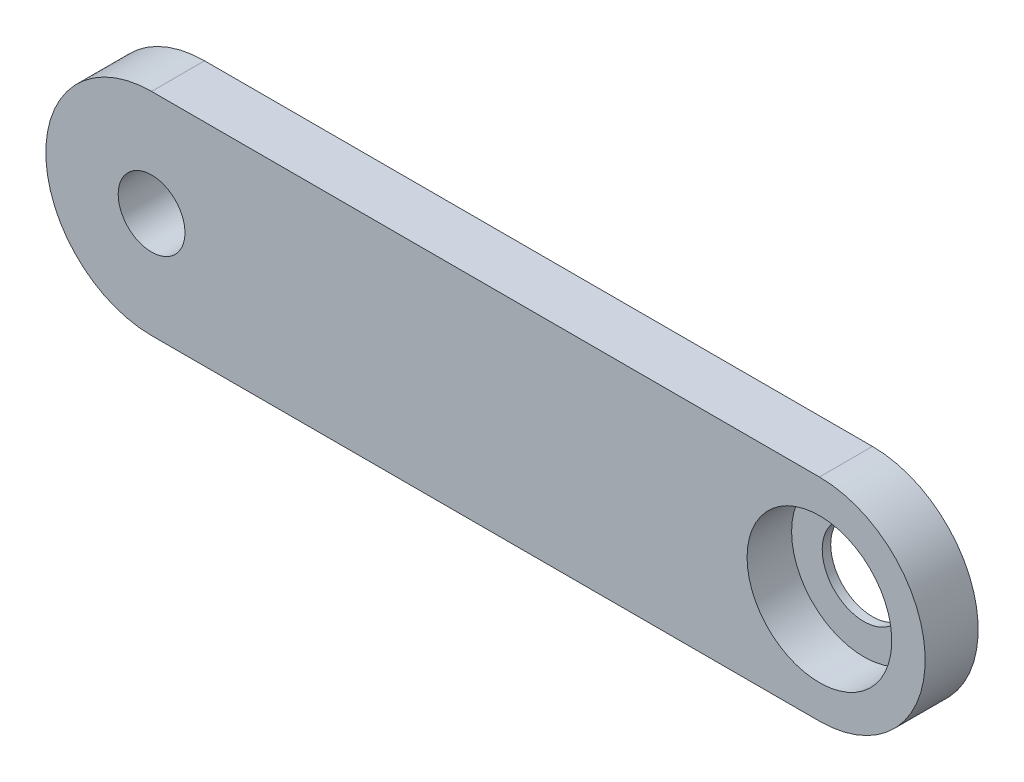
ISO-10303-21;
HEADER;
FILE_DESCRIPTION(('STEP AP214'),'2;1');
FILE_NAME('part.step','',(''),(''),'','','');
FILE_SCHEMA(('AUTOMOTIVE_DESIGN { 1 0 10303 214 1 1 1 1 }'));
ENDSEC;
DATA;
#1=APPLICATION_CONTEXT('core data for automotive mechanical design processes');
#2=APPLICATION_PROTOCOL_DEFINITION('international standard','automotive_design',2000,#1);
#3=PRODUCT_CONTEXT('',#1,'mechanical');
#4=PRODUCT('Part','Part','',(#3));
#5=PRODUCT_RELATED_PRODUCT_CATEGORY('part','',(#4));
#6=PRODUCT_DEFINITION_FORMATION('','',#4);
#7=PRODUCT_DEFINITION_CONTEXT('part definition',#1,'design');
#8=PRODUCT_DEFINITION('design','',#6,#7);
#9=PRODUCT_DEFINITION_SHAPE('','',#8);
#10=(LENGTH_UNIT() NAMED_UNIT(*) SI_UNIT(.MILLI.,.METRE.));
#11=(NAMED_UNIT(*) PLANE_ANGLE_UNIT() SI_UNIT($,.RADIAN.));
#12=(NAMED_UNIT(*) SI_UNIT($,.STERADIAN.) SOLID_ANGLE_UNIT());
#13=UNCERTAINTY_MEASURE_WITH_UNIT(LENGTH_MEASURE(1.E-05),#10,'distance_accuracy_value','');
#14=(GEOMETRIC_REPRESENTATION_CONTEXT(3) GLOBAL_UNCERTAINTY_ASSIGNED_CONTEXT((#13)) GLOBAL_UNIT_ASSIGNED_CONTEXT((#10,
#11,#12)) REPRESENTATION_CONTEXT('',''));
#15=CARTESIAN_POINT('',(0.,0.,0.));
#16=DIRECTION('',(0.,0.,1.));
#17=DIRECTION('',(1.,0.,0.));
#18=AXIS2_PLACEMENT_3D('',#15,#16,#17);
#19=CARTESIAN_POINT('',(120.,0.,9.525));
#20=DIRECTION('',(0.,0.,-1.));
#21=DIRECTION('',(-1.,0.,0.));
#22=AXIS2_PLACEMENT_3D('',#19,#20,#21);
#23=CYLINDRICAL_SURFACE('',#22,13.);
#24=CARTESIAN_POINT('',(120.,0.,9.525));
#25=DIRECTION('',(0.,0.,1.));
#26=DIRECTION('',(1.,0.,0.));
#27=AXIS2_PLACEMENT_3D('',#24,#25,#26);
#28=CIRCLE('',#27,13.);
#29=CARTESIAN_POINT('',(107.,0.,9.525));
#30=VERTEX_POINT('',#29);
#31=EDGE_CURVE('E117',#30,#30,#28,.T.);
#32=CARTESIAN_POINT('',(120.,0.,1.525));
#33=DIRECTION('',(0.,0.,-1.));
#34=DIRECTION('',(-1.,0.,0.));
#35=AXIS2_PLACEMENT_3D('',#32,#33,#34);
#36=CIRCLE('',#35,13.);
#37=CARTESIAN_POINT('',(107.,0.,1.525));
#38=VERTEX_POINT('',#37);
#39=EDGE_CURVE('E122',#38,#38,#36,.T.);
#40=CARTESIAN_POINT('',(107.,0.,9.525));
#41=CARTESIAN_POINT('',(107.,0.,9.44166666666667));
#42=CARTESIAN_POINT('',(107.,0.,9.35833333333333));
#43=CARTESIAN_POINT('',(107.,0.,9.19166666666667));
#44=CARTESIAN_POINT('',(107.,0.,9.10833333333333));
#45=CARTESIAN_POINT('',(107.,0.,8.94166666666667));
#46=CARTESIAN_POINT('',(107.,0.,8.85833333333333));
#47=CARTESIAN_POINT('',(107.,0.,8.69166666666667));
#48=CARTESIAN_POINT('',(107.,0.,8.60833333333333));
#49=CARTESIAN_POINT('',(107.,0.,8.44166666666667));
#50=CARTESIAN_POINT('',(107.,0.,8.35833333333333));
#51=CARTESIAN_POINT('',(107.,0.,8.19166666666667));
#52=CARTESIAN_POINT('',(107.,0.,8.10833333333333));
#53=CARTESIAN_POINT('',(107.,0.,7.94166666666667));
#54=CARTESIAN_POINT('',(107.,0.,7.85833333333333));
#55=CARTESIAN_POINT('',(107.,0.,7.69166666666667));
#56=CARTESIAN_POINT('',(107.,0.,7.60833333333333));
#57=CARTESIAN_POINT('',(107.,0.,7.44166666666667));
#58=CARTESIAN_POINT('',(107.,0.,7.35833333333333));
#59=CARTESIAN_POINT('',(107.,0.,7.19166666666667));
#60=CARTESIAN_POINT('',(107.,0.,7.10833333333333));
#61=CARTESIAN_POINT('',(107.,0.,6.94166666666667));
#62=CARTESIAN_POINT('',(107.,0.,6.85833333333333));
#63=CARTESIAN_POINT('',(107.,0.,6.69166666666667));
#64=CARTESIAN_POINT('',(107.,0.,6.60833333333333));
#65=CARTESIAN_POINT('',(107.,0.,6.44166666666667));
#66=CARTESIAN_POINT('',(107.,0.,6.35833333333334));
#67=CARTESIAN_POINT('',(107.,0.,6.19166666666667));
#68=CARTESIAN_POINT('',(107.,0.,6.10833333333333));
#69=CARTESIAN_POINT('',(107.,0.,5.94166666666667));
#70=CARTESIAN_POINT('',(107.,0.,5.85833333333333));
#71=CARTESIAN_POINT('',(107.,0.,5.69166666666667));
#72=CARTESIAN_POINT('',(107.,0.,5.60833333333333));
#73=CARTESIAN_POINT('',(107.,0.,5.44166666666667));
#74=CARTESIAN_POINT('',(107.,0.,5.35833333333334));
#75=CARTESIAN_POINT('',(107.,0.,5.19166666666667));
#76=CARTESIAN_POINT('',(107.,0.,5.10833333333333));
#77=CARTESIAN_POINT('',(107.,0.,4.94166666666667));
#78=CARTESIAN_POINT('',(107.,0.,4.85833333333334));
#79=CARTESIAN_POINT('',(107.,0.,4.69166666666667));
#80=CARTESIAN_POINT('',(107.,0.,4.60833333333334));
#81=CARTESIAN_POINT('',(107.,0.,4.44166666666667));
#82=CARTESIAN_POINT('',(107.,0.,4.35833333333333));
#83=CARTESIAN_POINT('',(107.,0.,4.19166666666667));
#84=CARTESIAN_POINT('',(107.,0.,4.10833333333334));
#85=CARTESIAN_POINT('',(107.,0.,3.94166666666667));
#86=CARTESIAN_POINT('',(107.,0.,3.85833333333333));
#87=CARTESIAN_POINT('',(107.,0.,3.69166666666667));
#88=CARTESIAN_POINT('',(107.,0.,3.60833333333334));
#89=CARTESIAN_POINT('',(107.,0.,3.44166666666667));
#90=CARTESIAN_POINT('',(107.,0.,3.35833333333334));
#91=CARTESIAN_POINT('',(107.,0.,3.19166666666667));
#92=CARTESIAN_POINT('',(107.,0.,3.10833333333333));
#93=CARTESIAN_POINT('',(107.,0.,2.94166666666667));
#94=CARTESIAN_POINT('',(107.,0.,2.85833333333333));
#95=CARTESIAN_POINT('',(107.,0.,2.69166666666667));
#96=CARTESIAN_POINT('',(107.,0.,2.60833333333334));
#97=CARTESIAN_POINT('',(107.,0.,2.44166666666667));
#98=CARTESIAN_POINT('',(107.,0.,2.35833333333334));
#99=CARTESIAN_POINT('',(107.,0.,2.19166666666667));
#100=CARTESIAN_POINT('',(107.,0.,2.10833333333333));
#101=CARTESIAN_POINT('',(107.,0.,1.94166666666667));
#102=CARTESIAN_POINT('',(107.,0.,1.85833333333334));
#103=CARTESIAN_POINT('',(107.,0.,1.69166666666667));
#104=CARTESIAN_POINT('',(107.,0.,1.60833333333334));
#105=CARTESIAN_POINT('',(107.,0.,1.525));
#106=B_SPLINE_CURVE_WITH_KNOTS('',3,(#40,#41,#42,#43,#44,#45,#46,#47,#48,#49,#50,#51,#52,#53,
#54,#55,#56,#57,#58,#59,#60,#61,#62,#63,#64,#65,#66,#67,#68,#69,#70,#71,#72,#73,#74,#75,#76,#77,
#78,#79,#80,#81,#82,#83,#84,#85,#86,#87,#88,#89,#90,#91,#92,#93,#94,#95,#96,#97,#98,#99,#100,
#101,#102,#103,#104,#105),.UNSPECIFIED.,.F.,.F.,(4,2,2,2,2,2,2,2,2,2,2,2,2,2,2,2,2,2,2,2,2,2,2,
2,2,2,2,2,2,2,2,2,4),(0.,0.249999999999999,0.499999999999999,0.749999999999999,
0.999999999999999,1.25,1.5,1.75,2.,2.25,2.5,2.75,3.,3.25,3.5,3.75,4.,4.25,4.5,4.75,5.,5.25,5.5,
5.75,6.,6.25,6.5,6.75,7.,7.25,7.5,7.75,8.),.UNSPECIFIED.);
#107=EDGE_CURVE('BSEAM34',#30,#38,#106,.T.);
#108=ORIENTED_EDGE('',*,*,#31,.T.);
#109=ORIENTED_EDGE('',*,*,#39,.T.);
#110=ORIENTED_EDGE('',*,*,#107,.T.);
#111=ORIENTED_EDGE('',*,*,#107,.F.);
#112=EDGE_LOOP('',(#108,#110,#109,#111));
#113=FACE_BOUND('',#112,.T.);
#114=ADVANCED_FACE('F34',(#113),#23,.F.);
#115=CARTESIAN_POINT('',(0.,0.,9.525));
#116=DIRECTION('',(0.,0.,1.));
#117=DIRECTION('',(1.,0.,0.));
#118=AXIS2_PLACEMENT_3D('',#115,#116,#117);
#119=PLANE('',#118);
#120=CARTESIAN_POINT('',(0.,0.,9.525));
#121=DIRECTION('',(0.,0.,1.));
#122=DIRECTION('',(1.,0.,0.));
#123=AXIS2_PLACEMENT_3D('',#120,#121,#122);
#124=CIRCLE('',#123,6.);
#125=CARTESIAN_POINT('',(-6.,0.,9.525));
#126=VERTEX_POINT('',#125);
#127=EDGE_CURVE('E102',#126,#126,#124,.T.);
#128=ORIENTED_EDGE('',*,*,#127,.F.);
#129=EDGE_LOOP('',(#128));
#130=FACE_BOUND('',#129,.T.);
#131=CARTESIAN_POINT('',(0.,0.,9.525));
#132=DIRECTION('',(0.,0.,1.));
#133=DIRECTION('',(1.,0.,0.));
#134=AXIS2_PLACEMENT_3D('',#131,#132,#133);
#135=CIRCLE('',#134,19.);
#136=CARTESIAN_POINT('',(0.,19.,9.525));
#137=VERTEX_POINT('',#136);
#138=CARTESIAN_POINT('',(0.,-19.,9.525));
#139=VERTEX_POINT('',#138);
#140=EDGE_CURVE('E87',#137,#139,#135,.T.);
#141=ORIENTED_EDGE('',*,*,#140,.T.);
#142=DIRECTION('',(1.,0.,0.));
#143=VECTOR('',#142,1.);
#144=CARTESIAN_POINT('',(0.,-19.,9.525));
#145=LINE('',#144,#143);
#146=CARTESIAN_POINT('',(120.,-19.,9.525));
#147=VERTEX_POINT('',#146);
#148=EDGE_CURVE('E81',#139,#147,#145,.T.);
#149=ORIENTED_EDGE('',*,*,#148,.T.);
#150=CARTESIAN_POINT('',(120.,0.,9.525));
#151=DIRECTION('',(0.,0.,1.));
#152=DIRECTION('',(1.,0.,0.));
#153=AXIS2_PLACEMENT_3D('',#150,#151,#152);
#154=CIRCLE('',#153,19.);
#155=CARTESIAN_POINT('',(120.,19.,9.525));
#156=VERTEX_POINT('',#155);
#157=EDGE_CURVE('E85',#147,#156,#154,.T.);
#158=ORIENTED_EDGE('',*,*,#157,.T.);
#159=DIRECTION('',(-1.,0.,0.));
#160=VECTOR('',#159,1.);
#161=CARTESIAN_POINT('',(0.,19.,9.525));
#162=LINE('',#161,#160);
#163=EDGE_CURVE('E51',#156,#137,#162,.T.);
#164=ORIENTED_EDGE('',*,*,#163,.T.);
#165=EDGE_LOOP('',(#141,#149,#158,#164));
#166=FACE_BOUND('',#165,.T.);
#167=ORIENTED_EDGE('',*,*,#31,.F.);
#168=EDGE_LOOP('',(#167));
#169=FACE_BOUND('',#168,.T.);
#170=ADVANCED_FACE('F82',(#130,#166,#169),#119,.T.);
#171=CARTESIAN_POINT('',(0.,0.,0.));
#172=DIRECTION('',(0.,0.,1.));
#173=DIRECTION('',(1.,0.,0.));
#174=AXIS2_PLACEMENT_3D('',#171,#172,#173);
#175=PLANE('',#174);
#176=CARTESIAN_POINT('',(0.,0.,0.));
#177=DIRECTION('',(0.,0.,1.));
#178=DIRECTION('',(1.,0.,0.));
#179=AXIS2_PLACEMENT_3D('',#176,#177,#178);
#180=CIRCLE('',#179,19.);
#181=CARTESIAN_POINT('',(0.,19.,0.));
#182=VERTEX_POINT('',#181);
#183=CARTESIAN_POINT('',(0.,-19.,0.));
#184=VERTEX_POINT('',#183);
#185=EDGE_CURVE('E99',#182,#184,#180,.T.);
#186=ORIENTED_EDGE('',*,*,#185,.F.);
#187=DIRECTION('',(-1.,0.,0.));
#188=VECTOR('',#187,1.);
#189=CARTESIAN_POINT('',(0.,19.,0.));
#190=LINE('',#189,#188);
#191=CARTESIAN_POINT('',(120.,19.,0.));
#192=VERTEX_POINT('',#191);
#193=EDGE_CURVE('E74',#192,#182,#190,.T.);
#194=ORIENTED_EDGE('',*,*,#193,.F.);
#195=CARTESIAN_POINT('',(120.,0.,0.));
#196=DIRECTION('',(0.,0.,1.));
#197=DIRECTION('',(1.,0.,0.));
#198=AXIS2_PLACEMENT_3D('',#195,#196,#197);
#199=CIRCLE('',#198,19.);
#200=CARTESIAN_POINT('',(120.,-19.,0.));
#201=VERTEX_POINT('',#200);
#202=EDGE_CURVE('E68',#201,#192,#199,.T.);
#203=ORIENTED_EDGE('',*,*,#202,.F.);
#204=DIRECTION('',(1.,0.,0.));
#205=VECTOR('',#204,1.);
#206=CARTESIAN_POINT('',(0.,-19.,0.));
#207=LINE('',#206,#205);
#208=EDGE_CURVE('E91',#184,#201,#207,.T.);
#209=ORIENTED_EDGE('',*,*,#208,.F.);
#210=EDGE_LOOP('',(#186,#194,#203,#209));
#211=FACE_BOUND('',#210,.T.);
#212=CARTESIAN_POINT('',(0.,0.,0.));
#213=DIRECTION('',(0.,0.,1.));
#214=DIRECTION('',(1.,0.,0.));
#215=AXIS2_PLACEMENT_3D('',#212,#213,#214);
#216=CIRCLE('',#215,6.);
#217=CARTESIAN_POINT('',(-6.,0.,0.));
#218=VERTEX_POINT('',#217);
#219=EDGE_CURVE('E114',#218,#218,#216,.T.);
#220=ORIENTED_EDGE('',*,*,#219,.T.);
#221=EDGE_LOOP('',(#220));
#222=FACE_BOUND('',#221,.T.);
#223=CARTESIAN_POINT('',(120.,0.,0.));
#224=DIRECTION('',(0.,0.,-1.));
#225=DIRECTION('',(-1.,0.,0.));
#226=AXIS2_PLACEMENT_3D('',#223,#224,#225);
#227=CIRCLE('',#226,7.50000000000001);
#228=CARTESIAN_POINT('',(112.5,0.,0.));
#229=VERTEX_POINT('',#228);
#230=EDGE_CURVE('E126',#229,#229,#227,.T.);
#231=ORIENTED_EDGE('',*,*,#230,.F.);
#232=EDGE_LOOP('',(#231));
#233=FACE_BOUND('',#232,.T.);
#234=ADVANCED_FACE('F110',(#211,#222,#233),#175,.F.);
#235=CARTESIAN_POINT('',(0.,0.,9.525));
#236=DIRECTION('',(0.,0.,-1.));
#237=DIRECTION('',(-1.,0.,0.));
#238=AXIS2_PLACEMENT_3D('',#235,#236,#237);
#239=CYLINDRICAL_SURFACE('',#238,19.);
#240=ORIENTED_EDGE('',*,*,#185,.T.);
#241=DIRECTION('',(0.,0.,-1.));
#242=VECTOR('',#241,1.);
#243=CARTESIAN_POINT('',(0.,-19.,9.525));
#244=LINE('',#243,#242);
#245=EDGE_CURVE('E11',#139,#184,#244,.T.);
#246=ORIENTED_EDGE('',*,*,#245,.F.);
#247=ORIENTED_EDGE('',*,*,#140,.F.);
#248=DIRECTION('',(0.,0.,-1.));
#249=VECTOR('',#248,1.);
#250=CARTESIAN_POINT('',(0.,19.,9.525));
#251=LINE('',#250,#249);
#252=EDGE_CURVE('E95',#137,#182,#251,.T.);
#253=ORIENTED_EDGE('',*,*,#252,.T.);
#254=EDGE_LOOP('',(#240,#246,#247,#253));
#255=FACE_BOUND('',#254,.T.);
#256=ADVANCED_FACE('F36',(#255),#239,.T.);
#257=CARTESIAN_POINT('',(0.,-19.,9.525));
#258=DIRECTION('',(0.,1.,0.));
#259=DIRECTION('',(0.,0.,1.));
#260=AXIS2_PLACEMENT_3D('',#257,#258,#259);
#261=PLANE('',#260);
#262=ORIENTED_EDGE('',*,*,#208,.T.);
#263=DIRECTION('',(0.,0.,-1.));
#264=VECTOR('',#263,1.);
#265=CARTESIAN_POINT('',(120.,-19.,9.525));
#266=LINE('',#265,#264);
#267=EDGE_CURVE('E43',#147,#201,#266,.T.);
#268=ORIENTED_EDGE('',*,*,#267,.F.);
#269=ORIENTED_EDGE('',*,*,#148,.F.);
#270=ORIENTED_EDGE('',*,*,#245,.T.);
#271=EDGE_LOOP('',(#262,#268,#269,#270));
#272=FACE_BOUND('',#271,.T.);
#273=ADVANCED_FACE('F90',(#272),#261,.F.);
#274=CARTESIAN_POINT('',(120.,0.,9.525));
#275=DIRECTION('',(0.,0.,-1.));
#276=DIRECTION('',(-1.,0.,0.));
#277=AXIS2_PLACEMENT_3D('',#274,#275,#276);
#278=CYLINDRICAL_SURFACE('',#277,19.);
#279=ORIENTED_EDGE('',*,*,#202,.T.);
#280=DIRECTION('',(0.,0.,-1.));
#281=VECTOR('',#280,1.);
#282=CARTESIAN_POINT('',(120.,19.,9.525));
#283=LINE('',#282,#281);
#284=EDGE_CURVE('E92',#156,#192,#283,.T.);
#285=ORIENTED_EDGE('',*,*,#284,.F.);
#286=ORIENTED_EDGE('',*,*,#157,.F.);
#287=ORIENTED_EDGE('',*,*,#267,.T.);
#288=EDGE_LOOP('',(#279,#285,#286,#287));
#289=FACE_BOUND('',#288,.T.);
#290=ADVANCED_FACE('F93',(#289),#278,.T.);
#291=CARTESIAN_POINT('',(0.,19.,9.525));
#292=DIRECTION('',(0.,-1.,0.));
#293=DIRECTION('',(0.,0.,-1.));
#294=AXIS2_PLACEMENT_3D('',#291,#292,#293);
#295=PLANE('',#294);
#296=ORIENTED_EDGE('',*,*,#193,.T.);
#297=ORIENTED_EDGE('',*,*,#252,.F.);
#298=ORIENTED_EDGE('',*,*,#163,.F.);
#299=ORIENTED_EDGE('',*,*,#284,.T.);
#300=EDGE_LOOP('',(#296,#297,#298,#299));
#301=FACE_BOUND('',#300,.T.);
#302=ADVANCED_FACE('F107',(#301),#295,.F.);
#303=CARTESIAN_POINT('',(0.,0.,9.525));
#304=DIRECTION('',(0.,0.,-1.));
#305=DIRECTION('',(-1.,0.,0.));
#306=AXIS2_PLACEMENT_3D('',#303,#304,#305);
#307=CYLINDRICAL_SURFACE('',#306,6.);
#308=CARTESIAN_POINT('',(-6.,0.,9.525));
#309=CARTESIAN_POINT('',(-6.,0.,9.42578125));
#310=CARTESIAN_POINT('',(-6.,0.,9.3265625));
#311=CARTESIAN_POINT('',(-6.,0.,9.128125));
#312=CARTESIAN_POINT('',(-6.,0.,9.02890625));
#313=CARTESIAN_POINT('',(-6.,0.,8.83046875));
#314=CARTESIAN_POINT('',(-6.,0.,8.73125));
#315=CARTESIAN_POINT('',(-6.,0.,8.5328125));
#316=CARTESIAN_POINT('',(-6.,0.,8.43359375));
#317=CARTESIAN_POINT('',(-6.,0.,8.23515625));
#318=CARTESIAN_POINT('',(-6.,0.,8.1359375));
#319=CARTESIAN_POINT('',(-6.,0.,7.9375));
#320=CARTESIAN_POINT('',(-6.,0.,7.83828125));
#321=CARTESIAN_POINT('',(-6.,0.,7.63984375));
#322=CARTESIAN_POINT('',(-6.,0.,7.540625));
#323=CARTESIAN_POINT('',(-6.,0.,7.3421875));
#324=CARTESIAN_POINT('',(-6.,0.,7.24296875));
#325=CARTESIAN_POINT('',(-6.,0.,7.04453125));
#326=CARTESIAN_POINT('',(-6.,0.,6.9453125));
#327=CARTESIAN_POINT('',(-6.,0.,6.746875));
#328=CARTESIAN_POINT('',(-6.,0.,6.64765625));
#329=CARTESIAN_POINT('',(-6.,0.,6.44921875));
#330=CARTESIAN_POINT('',(-6.,0.,6.35));
#331=CARTESIAN_POINT('',(-6.,0.,6.1515625));
#332=CARTESIAN_POINT('',(-6.,0.,6.05234375));
#333=CARTESIAN_POINT('',(-6.,0.,5.85390625));
#334=CARTESIAN_POINT('',(-6.,0.,5.7546875));
#335=CARTESIAN_POINT('',(-6.,0.,5.55625));
#336=CARTESIAN_POINT('',(-6.,0.,5.45703125));
#337=CARTESIAN_POINT('',(-6.,0.,5.25859375));
#338=CARTESIAN_POINT('',(-6.,0.,5.159375));
#339=CARTESIAN_POINT('',(-6.,0.,4.9609375));
#340=CARTESIAN_POINT('',(-6.,0.,4.86171875));
#341=CARTESIAN_POINT('',(-6.,0.,4.66328125));
#342=CARTESIAN_POINT('',(-6.,0.,4.5640625));
#343=CARTESIAN_POINT('',(-6.,0.,4.365625));
#344=CARTESIAN_POINT('',(-6.,0.,4.26640625));
#345=CARTESIAN_POINT('',(-6.,0.,4.06796875));
#346=CARTESIAN_POINT('',(-6.,0.,3.96875));
#347=CARTESIAN_POINT('',(-6.,0.,3.7703125));
#348=CARTESIAN_POINT('',(-6.,0.,3.67109375));
#349=CARTESIAN_POINT('',(-6.,0.,3.47265625));
#350=CARTESIAN_POINT('',(-6.,0.,3.3734375));
#351=CARTESIAN_POINT('',(-6.,0.,3.175));
#352=CARTESIAN_POINT('',(-6.,0.,3.07578125));
#353=CARTESIAN_POINT('',(-6.,0.,2.87734375));
#354=CARTESIAN_POINT('',(-6.,0.,2.778125));
#355=CARTESIAN_POINT('',(-6.,0.,2.5796875));
#356=CARTESIAN_POINT('',(-6.,0.,2.48046875));
#357=CARTESIAN_POINT('',(-6.,0.,2.28203125));
#358=CARTESIAN_POINT('',(-6.,0.,2.1828125));
#359=CARTESIAN_POINT('',(-6.,0.,1.984375));
#360=CARTESIAN_POINT('',(-6.,0.,1.88515625));
#361=CARTESIAN_POINT('',(-6.,0.,1.68671875));
#362=CARTESIAN_POINT('',(-6.,0.,1.5875));
#363=CARTESIAN_POINT('',(-6.,0.,1.3890625));
#364=CARTESIAN_POINT('',(-6.,0.,1.28984375));
#365=CARTESIAN_POINT('',(-6.,0.,1.09140625));
#366=CARTESIAN_POINT('',(-6.,0.,0.992187500000001));
#367=CARTESIAN_POINT('',(-6.,0.,0.793750000000001));
#368=CARTESIAN_POINT('',(-6.,0.,0.69453125));
#369=CARTESIAN_POINT('',(-6.,0.,0.49609375));
#370=CARTESIAN_POINT('',(-6.,0.,0.396875));
#371=CARTESIAN_POINT('',(-6.,0.,0.1984375));
#372=CARTESIAN_POINT('',(-6.,0.,0.0992187500000001));
#373=CARTESIAN_POINT('',(-6.,0.,0.));
#374=B_SPLINE_CURVE_WITH_KNOTS('',3,(#308,#309,#310,#311,#312,#313,#314,#315,#316,#317,#318,
#319,#320,#321,#322,#323,#324,#325,#326,#327,#328,#329,#330,#331,#332,#333,#334,#335,#336,#337,
#338,#339,#340,#341,#342,#343,#344,#345,#346,#347,#348,#349,#350,#351,#352,#353,#354,#355,#356,
#357,#358,#359,#360,#361,#362,#363,#364,#365,#366,#367,#368,#369,#370,#371,#372,#373),
.UNSPECIFIED.,.F.,.F.,(4,2,2,2,2,2,2,2,2,2,2,2,2,2,2,2,2,2,2,2,2,2,2,2,2,2,2,2,2,2,2,2,4),(0.,
0.29765625,0.5953125,0.892968750000001,1.190625,1.48828125,1.7859375,2.08359375,2.38125,
2.67890625,2.9765625,3.27421875,3.571875,3.86953125,4.1671875,4.46484375,4.7625,5.06015625,
5.3578125,5.65546875,5.953125,6.25078125,6.5484375,6.84609375,7.14375,7.44140625,7.7390625,
8.03671875,8.334375,8.63203125,8.9296875,9.22734375,9.525),.UNSPECIFIED.);
#375=EDGE_CURVE('BSEAM158',#126,#218,#374,.T.);
#376=ORIENTED_EDGE('',*,*,#127,.T.);
#377=ORIENTED_EDGE('',*,*,#219,.F.);
#378=ORIENTED_EDGE('',*,*,#375,.T.);
#379=ORIENTED_EDGE('',*,*,#375,.F.);
#380=EDGE_LOOP('',(#376,#378,#377,#379));
#381=FACE_BOUND('',#380,.T.);
#382=ADVANCED_FACE('F158',(#381),#307,.F.);
#383=CARTESIAN_POINT('',(120.,0.,1.525));
#384=DIRECTION('',(0.,0.,-1.));
#385=DIRECTION('',(-1.,0.,0.));
#386=AXIS2_PLACEMENT_3D('',#383,#384,#385);
#387=PLANE('',#386);
#388=CARTESIAN_POINT('',(120.,0.,1.525));
#389=DIRECTION('',(0.,0.,-1.));
#390=DIRECTION('',(-1.,0.,0.));
#391=AXIS2_PLACEMENT_3D('',#388,#389,#390);
#392=CIRCLE('',#391,7.50000000000001);
#393=CARTESIAN_POINT('',(112.5,0.,1.525));
#394=VERTEX_POINT('',#393);
#395=EDGE_CURVE('E125',#394,#394,#392,.T.);
#396=ORIENTED_EDGE('',*,*,#395,.T.);
#397=EDGE_LOOP('',(#396));
#398=FACE_BOUND('',#397,.T.);
#399=ORIENTED_EDGE('',*,*,#39,.F.);
#400=EDGE_LOOP('',(#399));
#401=FACE_BOUND('',#400,.T.);
#402=ADVANCED_FACE('F132',(#398,#401),#387,.F.);
#403=CARTESIAN_POINT('',(120.,0.,1.525));
#404=DIRECTION('',(0.,0.,-1.));
#405=DIRECTION('',(-1.,0.,0.));
#406=AXIS2_PLACEMENT_3D('',#403,#404,#405);
#407=CYLINDRICAL_SURFACE('',#406,7.50000000000001);
#408=ORIENTED_EDGE('',*,*,#395,.F.);
#409=EDGE_LOOP('',(#408));
#410=FACE_BOUND('',#409,.T.);
#411=ORIENTED_EDGE('',*,*,#230,.T.);
#412=EDGE_LOOP('',(#411));
#413=FACE_BOUND('',#412,.T.);
#414=ADVANCED_FACE('F135',(#410,#413),#407,.F.);
#415=CLOSED_SHELL('',(#114,#170,#234,#256,#273,#290,#302,#382,#402,#414));
#416=MANIFOLD_SOLID_BREP('B2',#415);
#417=ADVANCED_BREP_SHAPE_REPRESENTATION('',(#18,#416),#14);
#418=SHAPE_DEFINITION_REPRESENTATION(#9,#417);
ENDSEC;
END-ISO-10303-21;
